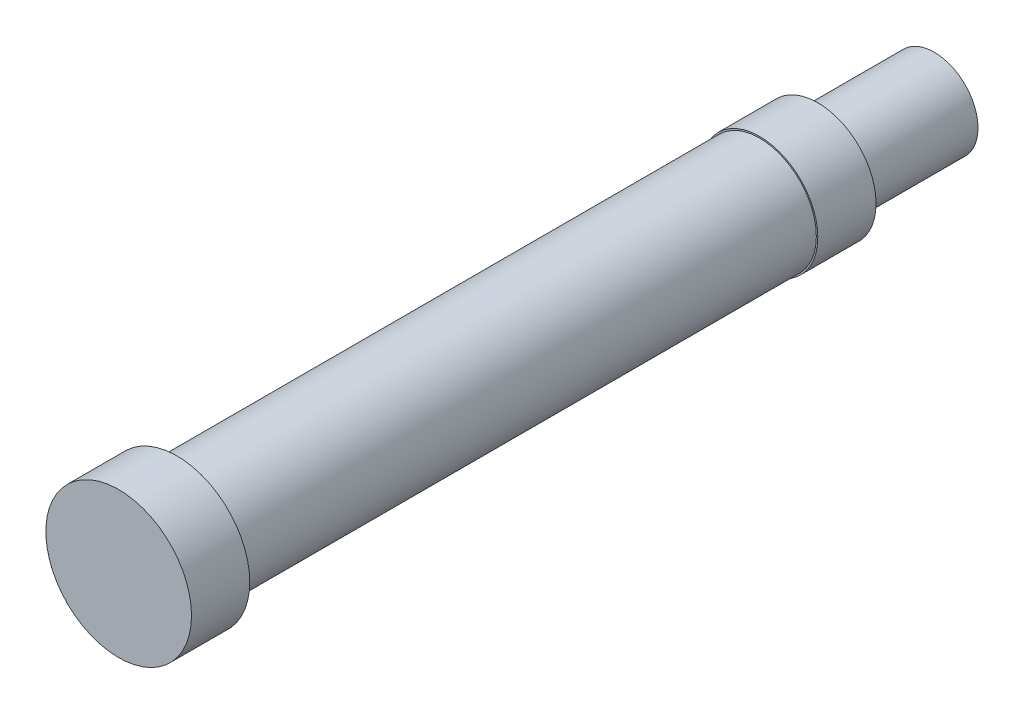
ISO-10303-21;
HEADER;
FILE_DESCRIPTION(('STEP AP214'),'2;1');
FILE_NAME('part.step','',(''),(''),'','','');
FILE_SCHEMA(('AUTOMOTIVE_DESIGN { 1 0 10303 214 1 1 1 1 }'));
ENDSEC;
DATA;
#1=APPLICATION_CONTEXT('core data for automotive mechanical design processes');
#2=APPLICATION_PROTOCOL_DEFINITION('international standard','automotive_design',2000,#1);
#3=PRODUCT_CONTEXT('',#1,'mechanical');
#4=PRODUCT('Part','Part','',(#3));
#5=PRODUCT_RELATED_PRODUCT_CATEGORY('part','',(#4));
#6=PRODUCT_DEFINITION_FORMATION('','',#4);
#7=PRODUCT_DEFINITION_CONTEXT('part definition',#1,'design');
#8=PRODUCT_DEFINITION('design','',#6,#7);
#9=PRODUCT_DEFINITION_SHAPE('','',#8);
#10=(LENGTH_UNIT() NAMED_UNIT(*) SI_UNIT(.MILLI.,.METRE.));
#11=(NAMED_UNIT(*) PLANE_ANGLE_UNIT() SI_UNIT($,.RADIAN.));
#12=(NAMED_UNIT(*) SI_UNIT($,.STERADIAN.) SOLID_ANGLE_UNIT());
#13=UNCERTAINTY_MEASURE_WITH_UNIT(LENGTH_MEASURE(1.E-05),#10,'distance_accuracy_value','');
#14=(GEOMETRIC_REPRESENTATION_CONTEXT(3) GLOBAL_UNCERTAINTY_ASSIGNED_CONTEXT((#13)) GLOBAL_UNIT_ASSIGNED_CONTEXT((#10,
#11,#12)) REPRESENTATION_CONTEXT('',''));
#15=CARTESIAN_POINT('',(0.,0.,0.));
#16=DIRECTION('',(0.,0.,1.));
#17=DIRECTION('',(1.,0.,0.));
#18=AXIS2_PLACEMENT_3D('',#15,#16,#17);
#19=CARTESIAN_POINT('',(0.,0.,4.));
#20=DIRECTION('',(0.,0.,-1.));
#21=DIRECTION('',(-1.,0.,0.));
#22=AXIS2_PLACEMENT_3D('',#19,#20,#21);
#23=CYLINDRICAL_SURFACE('',#22,1.5);
#24=CARTESIAN_POINT('',(0.,0.,4.));
#25=DIRECTION('',(0.,0.,1.));
#26=DIRECTION('',(1.,0.,0.));
#27=AXIS2_PLACEMENT_3D('',#24,#25,#26);
#28=CIRCLE('',#27,1.5);
#29=CARTESIAN_POINT('',(1.5,0.,4.));
#30=VERTEX_POINT('',#29);
#31=EDGE_CURVE('E38',#30,#30,#28,.T.);
#32=ORIENTED_EDGE('',*,*,#31,.F.);
#33=EDGE_LOOP('',(#32));
#34=FACE_BOUND('',#33,.T.);
#35=CARTESIAN_POINT('',(0.,0.,0.));
#36=DIRECTION('',(0.,0.,1.));
#37=DIRECTION('',(1.,0.,0.));
#38=AXIS2_PLACEMENT_3D('',#35,#36,#37);
#39=CIRCLE('',#38,1.5);
#40=CARTESIAN_POINT('',(1.5,0.,0.));
#41=VERTEX_POINT('',#40);
#42=EDGE_CURVE('E34',#41,#41,#39,.T.);
#43=ORIENTED_EDGE('',*,*,#42,.T.);
#44=EDGE_LOOP('',(#43));
#45=FACE_BOUND('',#44,.T.);
#46=ADVANCED_FACE('F31',(#34,#45),#23,.T.);
#47=CARTESIAN_POINT('',(0.,0.,0.));
#48=DIRECTION('',(0.,0.,1.));
#49=DIRECTION('',(1.,0.,0.));
#50=AXIS2_PLACEMENT_3D('',#47,#48,#49);
#51=PLANE('',#50);
#52=ORIENTED_EDGE('',*,*,#42,.F.);
#53=EDGE_LOOP('',(#52));
#54=FACE_BOUND('',#53,.T.);
#55=ADVANCED_FACE('F78',(#54),#51,.F.);
#56=CARTESIAN_POINT('',(0.,0.,6.));
#57=DIRECTION('',(0.,0.,-1.));
#58=DIRECTION('',(-1.,0.,0.));
#59=AXIS2_PLACEMENT_3D('',#56,#57,#58);
#60=CYLINDRICAL_SURFACE('',#59,2.);
#61=CARTESIAN_POINT('',(0.,0.,6.));
#62=DIRECTION('',(0.,0.,1.));
#63=DIRECTION('',(1.,0.,0.));
#64=AXIS2_PLACEMENT_3D('',#61,#62,#63);
#65=CIRCLE('',#64,2.);
#66=CARTESIAN_POINT('',(2.,0.,6.));
#67=VERTEX_POINT('',#66);
#68=EDGE_CURVE('E47',#67,#67,#65,.T.);
#69=ORIENTED_EDGE('',*,*,#68,.F.);
#70=EDGE_LOOP('',(#69));
#71=FACE_BOUND('',#70,.T.);
#72=CARTESIAN_POINT('',(0.,0.,4.));
#73=DIRECTION('',(0.,0.,1.));
#74=DIRECTION('',(1.,0.,0.));
#75=AXIS2_PLACEMENT_3D('',#72,#73,#74);
#76=CIRCLE('',#75,2.);
#77=CARTESIAN_POINT('',(2.,0.,4.));
#78=VERTEX_POINT('',#77);
#79=EDGE_CURVE('E50',#78,#78,#76,.T.);
#80=ORIENTED_EDGE('',*,*,#79,.T.);
#81=EDGE_LOOP('',(#80));
#82=FACE_BOUND('',#81,.T.);
#83=ADVANCED_FACE('F83',(#71,#82),#60,.T.);
#84=CARTESIAN_POINT('',(0.,0.,6.));
#85=DIRECTION('',(0.,0.,1.));
#86=DIRECTION('',(1.,0.,0.));
#87=AXIS2_PLACEMENT_3D('',#84,#85,#86);
#88=PLANE('',#87);
#89=CARTESIAN_POINT('',(0.,0.,6.));
#90=DIRECTION('',(0.,0.,1.));
#91=DIRECTION('',(1.,0.,0.));
#92=AXIS2_PLACEMENT_3D('',#89,#90,#91);
#93=CIRCLE('',#92,1.95);
#94=CARTESIAN_POINT('',(1.95,0.,6.));
#95=VERTEX_POINT('',#94);
#96=EDGE_CURVE('E10',#95,#95,#93,.T.);
#97=ORIENTED_EDGE('',*,*,#96,.F.);
#98=EDGE_LOOP('',(#97));
#99=FACE_BOUND('',#98,.T.);
#100=ORIENTED_EDGE('',*,*,#68,.T.);
#101=EDGE_LOOP('',(#100));
#102=FACE_BOUND('',#101,.T.);
#103=ADVANCED_FACE('F94',(#99,#102),#88,.T.);
#104=CARTESIAN_POINT('',(0.,0.,4.));
#105=DIRECTION('',(0.,0.,1.));
#106=DIRECTION('',(1.,0.,0.));
#107=AXIS2_PLACEMENT_3D('',#104,#105,#106);
#108=PLANE('',#107);
#109=ORIENTED_EDGE('',*,*,#31,.T.);
#110=EDGE_LOOP('',(#109));
#111=FACE_BOUND('',#110,.T.);
#112=ORIENTED_EDGE('',*,*,#79,.F.);
#113=EDGE_LOOP('',(#112));
#114=FACE_BOUND('',#113,.T.);
#115=ADVANCED_FACE('F90',(#111,#114),#108,.F.);
#116=CARTESIAN_POINT('',(0.,0.,26.));
#117=DIRECTION('',(0.,0.,-1.));
#118=DIRECTION('',(-1.,0.,0.));
#119=AXIS2_PLACEMENT_3D('',#116,#117,#118);
#120=CYLINDRICAL_SURFACE('',#119,1.95);
#121=CARTESIAN_POINT('',(0.,0.,26.));
#122=DIRECTION('',(0.,0.,1.));
#123=DIRECTION('',(1.,0.,0.));
#124=AXIS2_PLACEMENT_3D('',#121,#122,#123);
#125=CIRCLE('',#124,1.95);
#126=CARTESIAN_POINT('',(1.95,0.,26.));
#127=VERTEX_POINT('',#126);
#128=EDGE_CURVE('E45',#127,#127,#125,.T.);
#129=ORIENTED_EDGE('',*,*,#128,.F.);
#130=EDGE_LOOP('',(#129));
#131=FACE_BOUND('',#130,.T.);
#132=ORIENTED_EDGE('',*,*,#96,.T.);
#133=EDGE_LOOP('',(#132));
#134=FACE_BOUND('',#133,.T.);
#135=ADVANCED_FACE('F93',(#131,#134),#120,.T.);
#136=CARTESIAN_POINT('',(0.,0.,28.));
#137=DIRECTION('',(0.,0.,-1.));
#138=DIRECTION('',(-1.,0.,0.));
#139=AXIS2_PLACEMENT_3D('',#136,#137,#138);
#140=CYLINDRICAL_SURFACE('',#139,2.5);
#141=CARTESIAN_POINT('',(0.,0.,28.));
#142=DIRECTION('',(0.,0.,1.));
#143=DIRECTION('',(1.,0.,0.));
#144=AXIS2_PLACEMENT_3D('',#141,#142,#143);
#145=CIRCLE('',#144,2.5);
#146=CARTESIAN_POINT('',(2.5,0.,28.));
#147=VERTEX_POINT('',#146);
#148=EDGE_CURVE('E55',#147,#147,#145,.T.);
#149=ORIENTED_EDGE('',*,*,#148,.F.);
#150=EDGE_LOOP('',(#149));
#151=FACE_BOUND('',#150,.T.);
#152=CARTESIAN_POINT('',(0.,0.,26.));
#153=DIRECTION('',(0.,0.,1.));
#154=DIRECTION('',(1.,0.,0.));
#155=AXIS2_PLACEMENT_3D('',#152,#153,#154);
#156=CIRCLE('',#155,2.5);
#157=CARTESIAN_POINT('',(2.5,0.,26.));
#158=VERTEX_POINT('',#157);
#159=EDGE_CURVE('E59',#158,#158,#156,.T.);
#160=ORIENTED_EDGE('',*,*,#159,.T.);
#161=EDGE_LOOP('',(#160));
#162=FACE_BOUND('',#161,.T.);
#163=ADVANCED_FACE('F66',(#151,#162),#140,.T.);
#164=CARTESIAN_POINT('',(0.,0.,28.));
#165=DIRECTION('',(0.,0.,1.));
#166=DIRECTION('',(1.,0.,0.));
#167=AXIS2_PLACEMENT_3D('',#164,#165,#166);
#168=PLANE('',#167);
#169=ORIENTED_EDGE('',*,*,#148,.T.);
#170=EDGE_LOOP('',(#169));
#171=FACE_BOUND('',#170,.T.);
#172=ADVANCED_FACE('F70',(#171),#168,.T.);
#173=CARTESIAN_POINT('',(0.,0.,26.));
#174=DIRECTION('',(0.,0.,1.));
#175=DIRECTION('',(1.,0.,0.));
#176=AXIS2_PLACEMENT_3D('',#173,#174,#175);
#177=PLANE('',#176);
#178=ORIENTED_EDGE('',*,*,#128,.T.);
#179=EDGE_LOOP('',(#178));
#180=FACE_BOUND('',#179,.T.);
#181=ORIENTED_EDGE('',*,*,#159,.F.);
#182=EDGE_LOOP('',(#181));
#183=FACE_BOUND('',#182,.T.);
#184=ADVANCED_FACE('F68',(#180,#183),#177,.F.);
#185=CLOSED_SHELL('',(#46,#55,#83,#103,#115,#135,#163,#172,#184));
#186=MANIFOLD_SOLID_BREP('B2',#185);
#187=ADVANCED_BREP_SHAPE_REPRESENTATION('',(#18,#186),#14);
#188=SHAPE_DEFINITION_REPRESENTATION(#9,#187);
ENDSEC;
END-ISO-10303-21;
